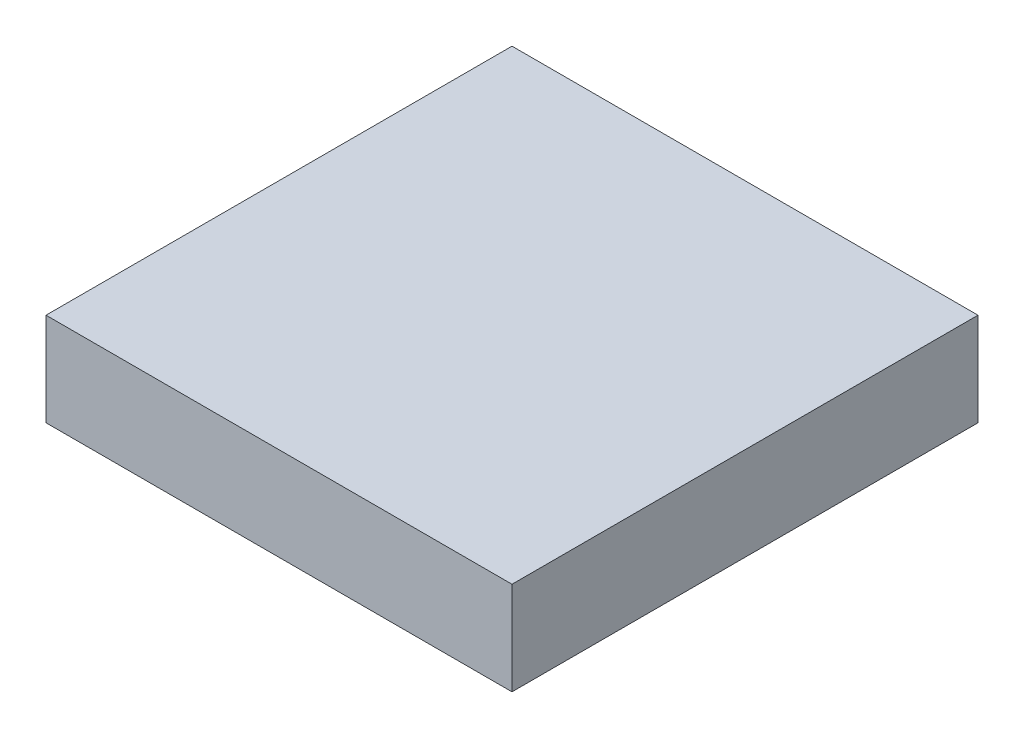
ISO-10303-21;
HEADER;
FILE_DESCRIPTION(('STEP AP214'),'2;1');
FILE_NAME('part.step','',(''),(''),'','','');
FILE_SCHEMA(('AUTOMOTIVE_DESIGN { 1 0 10303 214 1 1 1 1 }'));
ENDSEC;
DATA;
#1=APPLICATION_CONTEXT('core data for automotive mechanical design processes');
#2=APPLICATION_PROTOCOL_DEFINITION('international standard','automotive_design',2000,#1);
#3=PRODUCT_CONTEXT('',#1,'mechanical');
#4=PRODUCT('Part','Part','',(#3));
#5=PRODUCT_RELATED_PRODUCT_CATEGORY('part','',(#4));
#6=PRODUCT_DEFINITION_FORMATION('','',#4);
#7=PRODUCT_DEFINITION_CONTEXT('part definition',#1,'design');
#8=PRODUCT_DEFINITION('design','',#6,#7);
#9=PRODUCT_DEFINITION_SHAPE('','',#8);
#10=(LENGTH_UNIT() NAMED_UNIT(*) SI_UNIT(.MILLI.,.METRE.));
#11=(NAMED_UNIT(*) PLANE_ANGLE_UNIT() SI_UNIT($,.RADIAN.));
#12=(NAMED_UNIT(*) SI_UNIT($,.STERADIAN.) SOLID_ANGLE_UNIT());
#13=UNCERTAINTY_MEASURE_WITH_UNIT(LENGTH_MEASURE(1.E-05),#10,'distance_accuracy_value','');
#14=(GEOMETRIC_REPRESENTATION_CONTEXT(3) GLOBAL_UNCERTAINTY_ASSIGNED_CONTEXT((#13)) GLOBAL_UNIT_ASSIGNED_CONTEXT((#10,
#11,#12)) REPRESENTATION_CONTEXT('',''));
#15=CARTESIAN_POINT('',(0.,0.,0.));
#16=DIRECTION('',(0.,0.,1.));
#17=DIRECTION('',(1.,0.,0.));
#18=AXIS2_PLACEMENT_3D('',#15,#16,#17);
#19=CARTESIAN_POINT('',(5.,2.,5.));
#20=DIRECTION('',(-1.,0.,0.));
#21=DIRECTION('',(0.,0.,1.));
#22=AXIS2_PLACEMENT_3D('',#19,#20,#21);
#23=PLANE('',#22);
#24=DIRECTION('',(0.,0.,-1.));
#25=VECTOR('',#24,1.);
#26=CARTESIAN_POINT('',(5.,0.,5.));
#27=LINE('',#26,#25);
#28=CARTESIAN_POINT('',(5.,0.,5.));
#29=VERTEX_POINT('',#28);
#30=CARTESIAN_POINT('',(5.,0.,-5.));
#31=VERTEX_POINT('',#30);
#32=EDGE_CURVE('E98',#29,#31,#27,.T.);
#33=ORIENTED_EDGE('',*,*,#32,.T.);
#34=DIRECTION('',(0.,-1.,0.));
#35=VECTOR('',#34,1.);
#36=CARTESIAN_POINT('',(5.,2.,-5.));
#37=LINE('',#36,#35);
#38=CARTESIAN_POINT('',(5.,2.,-5.));
#39=VERTEX_POINT('',#38);
#40=EDGE_CURVE('E11',#39,#31,#37,.T.);
#41=ORIENTED_EDGE('',*,*,#40,.F.);
#42=DIRECTION('',(0.,0.,-1.));
#43=VECTOR('',#42,1.);
#44=CARTESIAN_POINT('',(5.,2.,5.));
#45=LINE('',#44,#43);
#46=CARTESIAN_POINT('',(5.,2.,5.));
#47=VERTEX_POINT('',#46);
#48=EDGE_CURVE('E86',#47,#39,#45,.T.);
#49=ORIENTED_EDGE('',*,*,#48,.F.);
#50=DIRECTION('',(0.,-1.,0.));
#51=VECTOR('',#50,1.);
#52=CARTESIAN_POINT('',(5.,2.,5.));
#53=LINE('',#52,#51);
#54=EDGE_CURVE('E94',#47,#29,#53,.T.);
#55=ORIENTED_EDGE('',*,*,#54,.T.);
#56=EDGE_LOOP('',(#33,#41,#49,#55));
#57=FACE_BOUND('',#56,.T.);
#58=ADVANCED_FACE('F35',(#57),#23,.F.);
#59=CARTESIAN_POINT('',(-5.,2.,-5.));
#60=DIRECTION('',(0.,0.,1.));
#61=DIRECTION('',(1.,0.,0.));
#62=AXIS2_PLACEMENT_3D('',#59,#60,#61);
#63=PLANE('',#62);
#64=DIRECTION('',(-1.,0.,0.));
#65=VECTOR('',#64,1.);
#66=CARTESIAN_POINT('',(-5.,0.,-5.));
#67=LINE('',#66,#65);
#68=CARTESIAN_POINT('',(-5.,0.,-5.));
#69=VERTEX_POINT('',#68);
#70=EDGE_CURVE('E90',#31,#69,#67,.T.);
#71=ORIENTED_EDGE('',*,*,#70,.T.);
#72=DIRECTION('',(0.,-1.,0.));
#73=VECTOR('',#72,1.);
#74=CARTESIAN_POINT('',(-5.,2.,-5.));
#75=LINE('',#74,#73);
#76=CARTESIAN_POINT('',(-5.,2.,-5.));
#77=VERTEX_POINT('',#76);
#78=EDGE_CURVE('E43',#77,#69,#75,.T.);
#79=ORIENTED_EDGE('',*,*,#78,.F.);
#80=DIRECTION('',(-1.,0.,0.));
#81=VECTOR('',#80,1.);
#82=CARTESIAN_POINT('',(-5.,2.,-5.));
#83=LINE('',#82,#81);
#84=EDGE_CURVE('E81',#39,#77,#83,.T.);
#85=ORIENTED_EDGE('',*,*,#84,.F.);
#86=ORIENTED_EDGE('',*,*,#40,.T.);
#87=EDGE_LOOP('',(#71,#79,#85,#86));
#88=FACE_BOUND('',#87,.T.);
#89=ADVANCED_FACE('F89',(#88),#63,.F.);
#90=CARTESIAN_POINT('',(-5.,2.,5.));
#91=DIRECTION('',(1.,0.,0.));
#92=DIRECTION('',(0.,0.,-1.));
#93=AXIS2_PLACEMENT_3D('',#90,#91,#92);
#94=PLANE('',#93);
#95=DIRECTION('',(0.,0.,1.));
#96=VECTOR('',#95,1.);
#97=CARTESIAN_POINT('',(-5.,0.,5.));
#98=LINE('',#97,#96);
#99=CARTESIAN_POINT('',(-5.,0.,5.));
#100=VERTEX_POINT('',#99);
#101=EDGE_CURVE('E68',#69,#100,#98,.T.);
#102=ORIENTED_EDGE('',*,*,#101,.T.);
#103=DIRECTION('',(0.,-1.,0.));
#104=VECTOR('',#103,1.);
#105=CARTESIAN_POINT('',(-5.,2.,5.));
#106=LINE('',#105,#104);
#107=CARTESIAN_POINT('',(-5.,2.,5.));
#108=VERTEX_POINT('',#107);
#109=EDGE_CURVE('E91',#108,#100,#106,.T.);
#110=ORIENTED_EDGE('',*,*,#109,.F.);
#111=DIRECTION('',(0.,0.,1.));
#112=VECTOR('',#111,1.);
#113=CARTESIAN_POINT('',(-5.,2.,5.));
#114=LINE('',#113,#112);
#115=EDGE_CURVE('E84',#77,#108,#114,.T.);
#116=ORIENTED_EDGE('',*,*,#115,.F.);
#117=ORIENTED_EDGE('',*,*,#78,.T.);
#118=EDGE_LOOP('',(#102,#110,#116,#117));
#119=FACE_BOUND('',#118,.T.);
#120=ADVANCED_FACE('F92',(#119),#94,.F.);
#121=CARTESIAN_POINT('',(-5.,2.,5.));
#122=DIRECTION('',(0.,0.,-1.));
#123=DIRECTION('',(-1.,0.,0.));
#124=AXIS2_PLACEMENT_3D('',#121,#122,#123);
#125=PLANE('',#124);
#126=DIRECTION('',(1.,0.,0.));
#127=VECTOR('',#126,1.);
#128=CARTESIAN_POINT('',(-5.,0.,5.));
#129=LINE('',#128,#127);
#130=EDGE_CURVE('E74',#100,#29,#129,.T.);
#131=ORIENTED_EDGE('',*,*,#130,.T.);
#132=ORIENTED_EDGE('',*,*,#54,.F.);
#133=DIRECTION('',(1.,0.,0.));
#134=VECTOR('',#133,1.);
#135=CARTESIAN_POINT('',(-5.,2.,5.));
#136=LINE('',#135,#134);
#137=EDGE_CURVE('E51',#108,#47,#136,.T.);
#138=ORIENTED_EDGE('',*,*,#137,.F.);
#139=ORIENTED_EDGE('',*,*,#109,.T.);
#140=EDGE_LOOP('',(#131,#132,#138,#139));
#141=FACE_BOUND('',#140,.T.);
#142=ADVANCED_FACE('F105',(#141),#125,.F.);
#143=CARTESIAN_POINT('',(0.,2.,0.));
#144=DIRECTION('',(0.,-1.,0.));
#145=DIRECTION('',(0.,0.,-1.));
#146=AXIS2_PLACEMENT_3D('',#143,#144,#145);
#147=PLANE('',#146);
#148=ORIENTED_EDGE('',*,*,#48,.T.);
#149=ORIENTED_EDGE('',*,*,#84,.T.);
#150=ORIENTED_EDGE('',*,*,#115,.T.);
#151=ORIENTED_EDGE('',*,*,#137,.T.);
#152=EDGE_LOOP('',(#148,#149,#150,#151));
#153=FACE_BOUND('',#152,.T.);
#154=ADVANCED_FACE('F82',(#153),#147,.F.);
#155=CARTESIAN_POINT('',(0.,0.,0.));
#156=DIRECTION('',(0.,-1.,0.));
#157=DIRECTION('',(0.,0.,-1.));
#158=AXIS2_PLACEMENT_3D('',#155,#156,#157);
#159=PLANE('',#158);
#160=ORIENTED_EDGE('',*,*,#32,.F.);
#161=ORIENTED_EDGE('',*,*,#130,.F.);
#162=ORIENTED_EDGE('',*,*,#101,.F.);
#163=ORIENTED_EDGE('',*,*,#70,.F.);
#164=EDGE_LOOP('',(#160,#161,#162,#163));
#165=FACE_BOUND('',#164,.T.);
#166=ADVANCED_FACE('F108',(#165),#159,.T.);
#167=CLOSED_SHELL('',(#58,#89,#120,#142,#154,#166));
#168=MANIFOLD_SOLID_BREP('B2',#167);
#169=ADVANCED_BREP_SHAPE_REPRESENTATION('',(#18,#168),#14);
#170=SHAPE_DEFINITION_REPRESENTATION(#9,#169);
ENDSEC;
END-ISO-10303-21;
